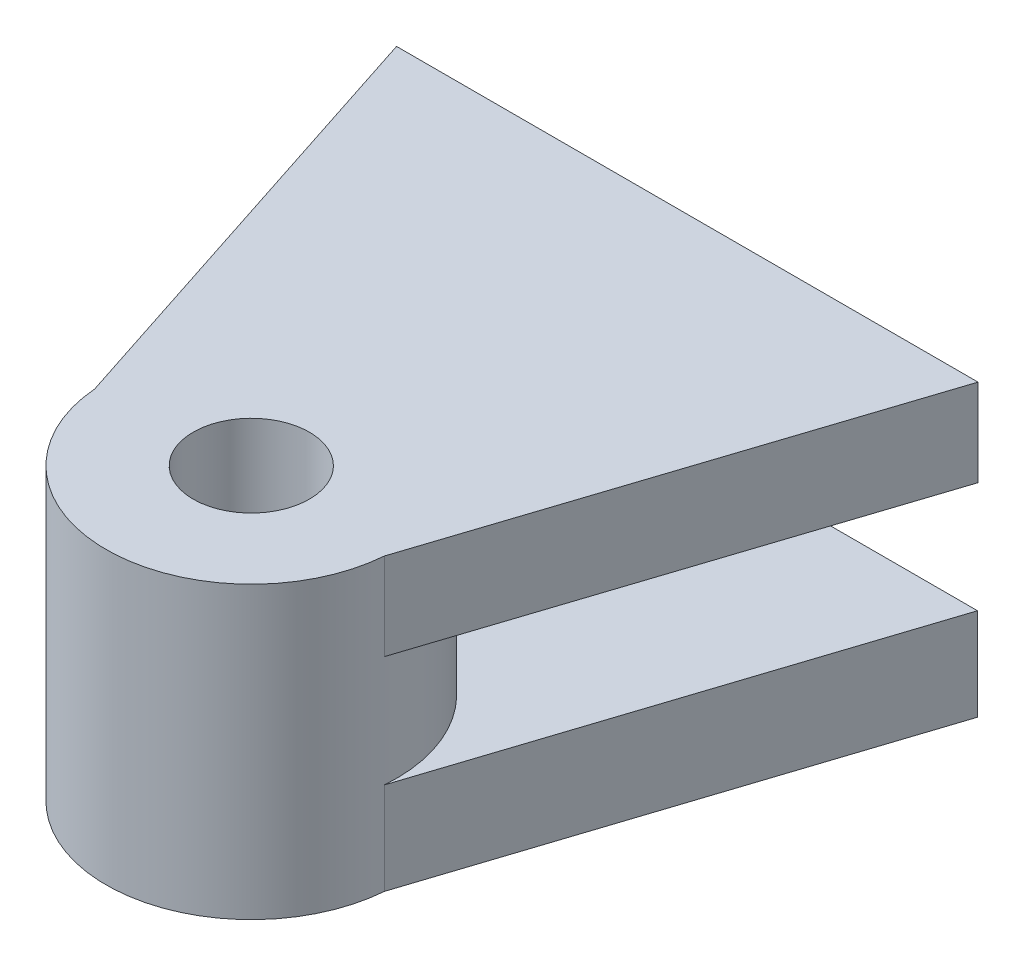
ISO-10303-21;
HEADER;
FILE_DESCRIPTION(('STEP AP214'),'2;1');
FILE_NAME('part.step','',(''),(''),'','','');
FILE_SCHEMA(('AUTOMOTIVE_DESIGN { 1 0 10303 214 1 1 1 1 }'));
ENDSEC;
DATA;
#1=APPLICATION_CONTEXT('core data for automotive mechanical design processes');
#2=APPLICATION_PROTOCOL_DEFINITION('international standard','automotive_design',2000,#1);
#3=PRODUCT_CONTEXT('',#1,'mechanical');
#4=PRODUCT('Part','Part','',(#3));
#5=PRODUCT_RELATED_PRODUCT_CATEGORY('part','',(#4));
#6=PRODUCT_DEFINITION_FORMATION('','',#4);
#7=PRODUCT_DEFINITION_CONTEXT('part definition',#1,'design');
#8=PRODUCT_DEFINITION('design','',#6,#7);
#9=PRODUCT_DEFINITION_SHAPE('','',#8);
#10=(LENGTH_UNIT() NAMED_UNIT(*) SI_UNIT(.MILLI.,.METRE.));
#11=(NAMED_UNIT(*) PLANE_ANGLE_UNIT() SI_UNIT($,.RADIAN.));
#12=(NAMED_UNIT(*) SI_UNIT($,.STERADIAN.) SOLID_ANGLE_UNIT());
#13=UNCERTAINTY_MEASURE_WITH_UNIT(LENGTH_MEASURE(1.E-05),#10,'distance_accuracy_value','');
#14=(GEOMETRIC_REPRESENTATION_CONTEXT(3) GLOBAL_UNCERTAINTY_ASSIGNED_CONTEXT((#13)) GLOBAL_UNIT_ASSIGNED_CONTEXT((#10,
#11,#12)) REPRESENTATION_CONTEXT('',''));
#15=CARTESIAN_POINT('',(0.,0.,0.));
#16=DIRECTION('',(0.,0.,1.));
#17=DIRECTION('',(1.,0.,0.));
#18=AXIS2_PLACEMENT_3D('',#15,#16,#17);
#19=CARTESIAN_POINT('',(20.,6.35,30.));
#20=DIRECTION('',(0.,-1.,0.));
#21=DIRECTION('',(0.,0.,-1.));
#22=AXIS2_PLACEMENT_3D('',#19,#20,#21);
#23=CYLINDRICAL_SURFACE('',#22,10.);
#24=CARTESIAN_POINT('',(20.,14.,30.));
#25=DIRECTION('',(0.,1.,0.));
#26=DIRECTION('',(0.,0.,1.));
#27=AXIS2_PLACEMENT_3D('',#24,#25,#26);
#28=CIRCLE('',#27,10.);
#29=CARTESIAN_POINT('',(29.9674416778354,14.,30.8062917579577));
#30=VERTEX_POINT('',#29);
#31=CARTESIAN_POINT('',(12.7764046592929,14.,23.0848231870968));
#32=VERTEX_POINT('',#31);
#33=EDGE_CURVE('E95',#30,#32,#28,.T.);
#34=ORIENTED_EDGE('',*,*,#33,.F.);
#35=DIRECTION('',(0.,1.,0.));
#36=VECTOR('',#35,1.);
#37=CARTESIAN_POINT('',(29.9674416778354,14.,30.8062917579577));
#38=LINE('',#37,#36);
#39=CARTESIAN_POINT('',(29.9674416778354,20.,30.8062917579577));
#40=VERTEX_POINT('',#39);
#41=EDGE_CURVE('E162',#30,#40,#38,.T.);
#42=ORIENTED_EDGE('',*,*,#41,.T.);
#43=CARTESIAN_POINT('',(20.,20.,30.));
#44=DIRECTION('',(0.,1.,0.));
#45=DIRECTION('',(0.,0.,1.));
#46=AXIS2_PLACEMENT_3D('',#43,#44,#45);
#47=CIRCLE('',#46,10.);
#48=CARTESIAN_POINT('',(10.0325583221646,20.,30.8062917579577));
#49=VERTEX_POINT('',#48);
#50=EDGE_CURVE('E175',#49,#40,#47,.T.);
#51=ORIENTED_EDGE('',*,*,#50,.F.);
#52=DIRECTION('',(0.,-1.,0.));
#53=VECTOR('',#52,1.);
#54=CARTESIAN_POINT('',(10.0325583221646,6.35,30.8062917579577));
#55=LINE('',#54,#53);
#56=CARTESIAN_POINT('',(10.0325583221646,0.,30.8062917579577));
#57=VERTEX_POINT('',#56);
#58=EDGE_CURVE('E192',#49,#57,#55,.T.);
#59=ORIENTED_EDGE('',*,*,#58,.T.);
#60=CARTESIAN_POINT('',(20.,0.,30.));
#61=DIRECTION('',(0.,1.,0.));
#62=DIRECTION('',(0.,0.,1.));
#63=AXIS2_PLACEMENT_3D('',#60,#61,#62);
#64=CIRCLE('',#63,10.);
#65=CARTESIAN_POINT('',(29.9674416778354,0.,30.8062917579577));
#66=VERTEX_POINT('',#65);
#67=EDGE_CURVE('E197',#57,#66,#64,.T.);
#68=ORIENTED_EDGE('',*,*,#67,.T.);
#69=DIRECTION('',(0.,-1.,0.));
#70=VECTOR('',#69,1.);
#71=CARTESIAN_POINT('',(29.9674416778354,6.35,30.8062917579577));
#72=LINE('',#71,#70);
#73=CARTESIAN_POINT('',(29.9674416778354,6.35,30.8062917579577));
#74=VERTEX_POINT('',#73);
#75=EDGE_CURVE('E206',#74,#66,#72,.T.);
#76=ORIENTED_EDGE('',*,*,#75,.F.);
#77=CARTESIAN_POINT('',(20.,6.35,30.));
#78=DIRECTION('',(0.,1.,0.));
#79=DIRECTION('',(0.,0.,1.));
#80=AXIS2_PLACEMENT_3D('',#77,#78,#79);
#81=CIRCLE('',#80,10.);
#82=CARTESIAN_POINT('',(12.7764046592929,6.35,23.0848231870968));
#83=VERTEX_POINT('',#82);
#84=EDGE_CURVE('E12',#83,#74,#81,.F.);
#85=ORIENTED_EDGE('',*,*,#84,.F.);
#86=DIRECTION('',(0.,-1.,0.));
#87=VECTOR('',#86,1.);
#88=CARTESIAN_POINT('',(12.7764046592929,20.,23.0848231870968));
#89=LINE('',#88,#87);
#90=EDGE_CURVE('E183',#32,#83,#89,.T.);
#91=ORIENTED_EDGE('',*,*,#90,.F.);
#92=EDGE_LOOP('',(#34,#42,#51,#59,#68,#76,#85,#91));
#93=FACE_BOUND('',#92,.T.);
#94=ADVANCED_FACE('F81',(#93),#23,.T.);
#95=CARTESIAN_POINT('',(4.75423889480529,20.,-1.54829342539473));
#96=DIRECTION('',(0.950847778961059,0.,-0.309658685078945));
#97=DIRECTION('',(-0.309658685078945,0.,-0.950847778961059));
#98=AXIS2_PLACEMENT_3D('',#95,#96,#97);
#99=PLANE('',#98);
#100=DIRECTION('',(0.,-1.,0.));
#101=VECTOR('',#100,1.);
#102=CARTESIAN_POINT('',(5.25846524610199,20.,0.));
#103=LINE('',#102,#101);
#104=CARTESIAN_POINT('',(5.25846524610199,14.,0.));
#105=VERTEX_POINT('',#104);
#106=CARTESIAN_POINT('',(5.25846524610199,6.35,0.));
#107=VERTEX_POINT('',#106);
#108=EDGE_CURVE('E103',#105,#107,#103,.T.);
#109=ORIENTED_EDGE('',*,*,#108,.F.);
#110=DIRECTION('',(-0.309658685078945,0.,-0.950847778961059));
#111=VECTOR('',#110,1.);
#112=CARTESIAN_POINT('',(4.75423889480529,14.,-1.54829342539473));
#113=LINE('',#112,#111);
#114=EDGE_CURVE('E150',#32,#105,#113,.T.);
#115=ORIENTED_EDGE('',*,*,#114,.F.);
#116=ORIENTED_EDGE('',*,*,#90,.T.);
#117=DIRECTION('',(-0.309658685078945,0.,-0.950847778961059));
#118=VECTOR('',#117,1.);
#119=CARTESIAN_POINT('',(4.75423889480529,6.35,-1.54829342539473));
#120=LINE('',#119,#118);
#121=EDGE_CURVE('E88',#83,#107,#120,.T.);
#122=ORIENTED_EDGE('',*,*,#121,.T.);
#123=EDGE_LOOP('',(#109,#115,#116,#122));
#124=FACE_BOUND('',#123,.T.);
#125=ADVANCED_FACE('F212',(#124),#99,.T.);
#126=CARTESIAN_POINT('',(0.,6.35,0.));
#127=DIRECTION('',(0.,1.,0.));
#128=DIRECTION('',(0.,0.,1.));
#129=AXIS2_PLACEMENT_3D('',#126,#127,#128);
#130=PLANE('',#129);
#131=ORIENTED_EDGE('',*,*,#121,.F.);
#132=ORIENTED_EDGE('',*,*,#84,.T.);
#133=DIRECTION('',(0.309658685078945,0.,-0.950847778961059));
#134=VECTOR('',#133,1.);
#135=CARTESIAN_POINT('',(36.1644599502072,6.35,11.7775309177327));
#136=LINE('',#135,#134);
#137=CARTESIAN_POINT('',(40.,6.35,0.));
#138=VERTEX_POINT('',#137);
#139=EDGE_CURVE('E186',#74,#138,#136,.T.);
#140=ORIENTED_EDGE('',*,*,#139,.T.);
#141=DIRECTION('',(1.,0.,0.));
#142=VECTOR('',#141,1.);
#143=CARTESIAN_POINT('',(0.,6.35,0.));
#144=LINE('',#143,#142);
#145=EDGE_CURVE('E189',#107,#138,#144,.T.);
#146=ORIENTED_EDGE('',*,*,#145,.F.);
#147=EDGE_LOOP('',(#131,#132,#140,#146));
#148=FACE_BOUND('',#147,.T.);
#149=ADVANCED_FACE('F216',(#148),#130,.T.);
#150=CARTESIAN_POINT('',(36.1644599502072,6.35,11.7775309177327));
#151=DIRECTION('',(-0.950847778961059,0.,-0.309658685078945));
#152=DIRECTION('',(-0.309658685078945,0.,0.950847778961059));
#153=AXIS2_PLACEMENT_3D('',#150,#151,#152);
#154=PLANE('',#153);
#155=DIRECTION('',(0.309658685078945,0.,-0.950847778961059));
#156=VECTOR('',#155,1.);
#157=CARTESIAN_POINT('',(36.1644599502072,0.,11.7775309177327));
#158=LINE('',#157,#156);
#159=CARTESIAN_POINT('',(40.,0.,0.));
#160=VERTEX_POINT('',#159);
#161=EDGE_CURVE('E193',#66,#160,#158,.T.);
#162=ORIENTED_EDGE('',*,*,#161,.T.);
#163=DIRECTION('',(0.,-1.,0.));
#164=VECTOR('',#163,1.);
#165=CARTESIAN_POINT('',(40.,6.35,0.));
#166=LINE('',#165,#164);
#167=EDGE_CURVE('E204',#138,#160,#166,.T.);
#168=ORIENTED_EDGE('',*,*,#167,.F.);
#169=ORIENTED_EDGE('',*,*,#139,.F.);
#170=ORIENTED_EDGE('',*,*,#75,.T.);
#171=EDGE_LOOP('',(#162,#168,#169,#170));
#172=FACE_BOUND('',#171,.T.);
#173=ADVANCED_FACE('F223',(#172),#154,.F.);
#174=CARTESIAN_POINT('',(0.,6.35,0.));
#175=DIRECTION('',(0.,0.,-1.));
#176=DIRECTION('',(-1.,0.,0.));
#177=AXIS2_PLACEMENT_3D('',#174,#175,#176);
#178=PLANE('',#177);
#179=ORIENTED_EDGE('',*,*,#167,.T.);
#180=DIRECTION('',(1.,0.,0.));
#181=VECTOR('',#180,1.);
#182=CARTESIAN_POINT('',(0.,0.,0.));
#183=LINE('',#182,#181);
#184=CARTESIAN_POINT('',(0.,0.,0.));
#185=VERTEX_POINT('',#184);
#186=EDGE_CURVE('E196',#185,#160,#183,.T.);
#187=ORIENTED_EDGE('',*,*,#186,.F.);
#188=DIRECTION('',(0.,-1.,0.));
#189=VECTOR('',#188,1.);
#190=CARTESIAN_POINT('',(0.,6.35,0.));
#191=LINE('',#190,#189);
#192=CARTESIAN_POINT('',(0.,20.,0.));
#193=VERTEX_POINT('',#192);
#194=EDGE_CURVE('E202',#193,#185,#191,.T.);
#195=ORIENTED_EDGE('',*,*,#194,.F.);
#196=DIRECTION('',(1.,0.,0.));
#197=VECTOR('',#196,1.);
#198=CARTESIAN_POINT('',(0.,20.,0.));
#199=LINE('',#198,#197);
#200=CARTESIAN_POINT('',(40.0341756689437,20.,0.));
#201=VERTEX_POINT('',#200);
#202=EDGE_CURVE('E158',#193,#201,#199,.T.);
#203=ORIENTED_EDGE('',*,*,#202,.T.);
#204=DIRECTION('',(0.,1.,0.));
#205=VECTOR('',#204,1.);
#206=CARTESIAN_POINT('',(40.0341756689437,14.,0.));
#207=LINE('',#206,#205);
#208=CARTESIAN_POINT('',(40.0341756689437,14.,0.));
#209=VERTEX_POINT('',#208);
#210=EDGE_CURVE('E154',#209,#201,#207,.T.);
#211=ORIENTED_EDGE('',*,*,#210,.F.);
#212=DIRECTION('',(1.,0.,0.));
#213=VECTOR('',#212,1.);
#214=CARTESIAN_POINT('',(0.,14.,0.));
#215=LINE('',#214,#213);
#216=EDGE_CURVE('E144',#105,#209,#215,.T.);
#217=ORIENTED_EDGE('',*,*,#216,.F.);
#218=ORIENTED_EDGE('',*,*,#108,.T.);
#219=ORIENTED_EDGE('',*,*,#145,.T.);
#220=EDGE_LOOP('',(#179,#187,#195,#203,#211,#217,#218,#219));
#221=FACE_BOUND('',#220,.T.);
#222=ADVANCED_FACE('F156',(#221),#178,.T.);
#223=CARTESIAN_POINT('',(0.,6.35,0.));
#224=DIRECTION('',(0.950847778961059,0.,-0.309658685078945));
#225=DIRECTION('',(-0.309658685078945,0.,-0.950847778961059));
#226=AXIS2_PLACEMENT_3D('',#223,#224,#225);
#227=PLANE('',#226);
#228=DIRECTION('',(0.309658685078945,0.,0.950847778961059));
#229=VECTOR('',#228,1.);
#230=CARTESIAN_POINT('',(0.,0.,0.));
#231=LINE('',#230,#229);
#232=EDGE_CURVE('E190',#185,#57,#231,.T.);
#233=ORIENTED_EDGE('',*,*,#232,.T.);
#234=ORIENTED_EDGE('',*,*,#58,.F.);
#235=DIRECTION('',(0.309658685078945,0.,0.950847778961059));
#236=VECTOR('',#235,1.);
#237=CARTESIAN_POINT('',(0.,20.,0.));
#238=LINE('',#237,#236);
#239=EDGE_CURVE('E179',#193,#49,#238,.T.);
#240=ORIENTED_EDGE('',*,*,#239,.F.);
#241=ORIENTED_EDGE('',*,*,#194,.T.);
#242=EDGE_LOOP('',(#233,#234,#240,#241));
#243=FACE_BOUND('',#242,.T.);
#244=ADVANCED_FACE('F231',(#243),#227,.F.);
#245=CARTESIAN_POINT('',(0.,0.,0.));
#246=DIRECTION('',(0.,1.,0.));
#247=DIRECTION('',(0.,0.,1.));
#248=AXIS2_PLACEMENT_3D('',#245,#246,#247);
#249=PLANE('',#248);
#250=ORIENTED_EDGE('',*,*,#161,.F.);
#251=ORIENTED_EDGE('',*,*,#67,.F.);
#252=ORIENTED_EDGE('',*,*,#232,.F.);
#253=ORIENTED_EDGE('',*,*,#186,.T.);
#254=EDGE_LOOP('',(#250,#251,#252,#253));
#255=FACE_BOUND('',#254,.T.);
#256=CARTESIAN_POINT('',(20.,0.,30.));
#257=DIRECTION('',(0.,1.,0.));
#258=DIRECTION('',(0.,0.,1.));
#259=AXIS2_PLACEMENT_3D('',#256,#257,#258);
#260=CIRCLE('',#259,4.00000000000002);
#261=CARTESIAN_POINT('',(20.,0.,34.));
#262=VERTEX_POINT('',#261);
#263=EDGE_CURVE('E185',#262,#262,#260,.T.);
#264=ORIENTED_EDGE('',*,*,#263,.T.);
#265=EDGE_LOOP('',(#264));
#266=FACE_BOUND('',#265,.T.);
#267=ADVANCED_FACE('F228',(#255,#266),#249,.F.);
#268=CARTESIAN_POINT('',(20.,6.35,30.));
#269=DIRECTION('',(0.,-1.,0.));
#270=DIRECTION('',(0.,0.,-1.));
#271=AXIS2_PLACEMENT_3D('',#268,#269,#270);
#272=CYLINDRICAL_SURFACE('',#271,4.00000000000002);
#273=CARTESIAN_POINT('',(20.,20.,30.));
#274=DIRECTION('',(0.,1.,0.));
#275=DIRECTION('',(0.,0.,1.));
#276=AXIS2_PLACEMENT_3D('',#273,#274,#275);
#277=CIRCLE('',#276,4.00000000000002);
#278=CARTESIAN_POINT('',(20.,20.,34.));
#279=VERTEX_POINT('',#278);
#280=EDGE_CURVE('E172',#279,#279,#277,.T.);
#281=ORIENTED_EDGE('',*,*,#280,.T.);
#282=EDGE_LOOP('',(#281));
#283=FACE_BOUND('',#282,.T.);
#284=ORIENTED_EDGE('',*,*,#263,.F.);
#285=EDGE_LOOP('',(#284));
#286=FACE_BOUND('',#285,.T.);
#287=ADVANCED_FACE('F237',(#283,#286),#272,.F.);
#288=CARTESIAN_POINT('',(0.,20.,0.));
#289=DIRECTION('',(0.,1.,0.));
#290=DIRECTION('',(0.,0.,1.));
#291=AXIS2_PLACEMENT_3D('',#288,#289,#290);
#292=PLANE('',#291);
#293=ORIENTED_EDGE('',*,*,#239,.T.);
#294=ORIENTED_EDGE('',*,*,#50,.T.);
#295=DIRECTION('',(-0.310611914905861,0.,0.950536815866968));
#296=VECTOR('',#295,1.);
#297=CARTESIAN_POINT('',(36.1716879412893,20.,11.8200127225725));
#298=LINE('',#297,#296);
#299=EDGE_CURVE('E165',#201,#40,#298,.T.);
#300=ORIENTED_EDGE('',*,*,#299,.F.);
#301=ORIENTED_EDGE('',*,*,#202,.F.);
#302=EDGE_LOOP('',(#293,#294,#300,#301));
#303=FACE_BOUND('',#302,.T.);
#304=ORIENTED_EDGE('',*,*,#280,.F.);
#305=EDGE_LOOP('',(#304));
#306=FACE_BOUND('',#305,.T.);
#307=ADVANCED_FACE('F234',(#303,#306),#292,.T.);
#308=CARTESIAN_POINT('',(0.,14.,0.));
#309=DIRECTION('',(0.,1.,0.));
#310=DIRECTION('',(0.,0.,1.));
#311=AXIS2_PLACEMENT_3D('',#308,#309,#310);
#312=PLANE('',#311);
#313=DIRECTION('',(-0.310611914905861,0.,0.950536815866968));
#314=VECTOR('',#313,1.);
#315=CARTESIAN_POINT('',(36.1716879412893,14.,11.8200127225725));
#316=LINE('',#315,#314);
#317=EDGE_CURVE('E148',#209,#30,#316,.T.);
#318=ORIENTED_EDGE('',*,*,#317,.T.);
#319=ORIENTED_EDGE('',*,*,#33,.T.);
#320=ORIENTED_EDGE('',*,*,#114,.T.);
#321=ORIENTED_EDGE('',*,*,#216,.T.);
#322=EDGE_LOOP('',(#318,#319,#320,#321));
#323=FACE_BOUND('',#322,.T.);
#324=ADVANCED_FACE('F146',(#323),#312,.F.);
#325=CARTESIAN_POINT('',(36.1716879412893,14.,11.8200127225725));
#326=DIRECTION('',(-0.950536815866968,0.,-0.310611914905861));
#327=DIRECTION('',(-0.310611914905861,0.,0.950536815866968));
#328=AXIS2_PLACEMENT_3D('',#325,#326,#327);
#329=PLANE('',#328);
#330=ORIENTED_EDGE('',*,*,#299,.T.);
#331=ORIENTED_EDGE('',*,*,#41,.F.);
#332=ORIENTED_EDGE('',*,*,#317,.F.);
#333=ORIENTED_EDGE('',*,*,#210,.T.);
#334=EDGE_LOOP('',(#330,#331,#332,#333));
#335=FACE_BOUND('',#334,.T.);
#336=ADVANCED_FACE('F164',(#335),#329,.F.);
#337=CLOSED_SHELL('',(#94,#125,#149,#173,#222,#244,#267,#287,#307,#324,#336));
#338=MANIFOLD_SOLID_BREP('B2',#337);
#339=ADVANCED_BREP_SHAPE_REPRESENTATION('',(#18,#338),#14);
#340=SHAPE_DEFINITION_REPRESENTATION(#9,#339);
ENDSEC;
END-ISO-10303-21;
